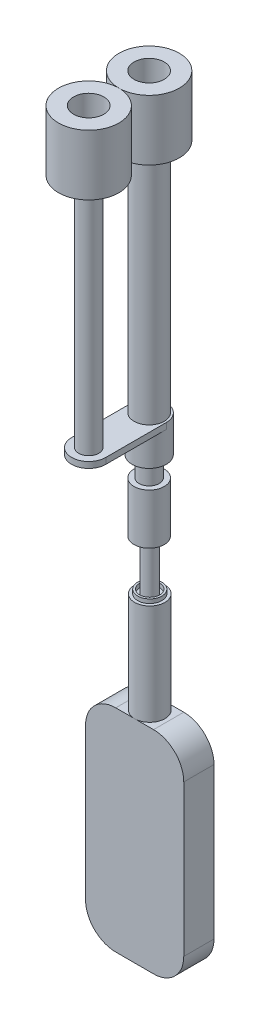
ISO-10303-21;
HEADER;
FILE_DESCRIPTION(('STEP AP214'),'2;1');
FILE_NAME('part.step','',(''),(''),'','','');
FILE_SCHEMA(('AUTOMOTIVE_DESIGN { 1 0 10303 214 1 1 1 1 }'));
ENDSEC;
DATA;
#1=APPLICATION_CONTEXT('core data for automotive mechanical design processes');
#2=APPLICATION_PROTOCOL_DEFINITION('international standard','automotive_design',2000,#1);
#3=PRODUCT_CONTEXT('',#1,'mechanical');
#4=PRODUCT('Part','Part','',(#3));
#5=PRODUCT_RELATED_PRODUCT_CATEGORY('part','',(#4));
#6=PRODUCT_DEFINITION_FORMATION('','',#4);
#7=PRODUCT_DEFINITION_CONTEXT('part definition',#1,'design');
#8=PRODUCT_DEFINITION('design','',#6,#7);
#9=PRODUCT_DEFINITION_SHAPE('','',#8);
#10=(LENGTH_UNIT() NAMED_UNIT(*) SI_UNIT(.MILLI.,.METRE.));
#11=(NAMED_UNIT(*) PLANE_ANGLE_UNIT() SI_UNIT($,.RADIAN.));
#12=(NAMED_UNIT(*) SI_UNIT($,.STERADIAN.) SOLID_ANGLE_UNIT());
#13=UNCERTAINTY_MEASURE_WITH_UNIT(LENGTH_MEASURE(1.E-05),#10,'distance_accuracy_value','');
#14=(GEOMETRIC_REPRESENTATION_CONTEXT(3) GLOBAL_UNCERTAINTY_ASSIGNED_CONTEXT((#13)) GLOBAL_UNIT_ASSIGNED_CONTEXT((#10,
#11,#12)) REPRESENTATION_CONTEXT('',''));
#15=CARTESIAN_POINT('',(0.,0.,0.));
#16=DIRECTION('',(0.,0.,1.));
#17=DIRECTION('',(1.,0.,0.));
#18=AXIS2_PLACEMENT_3D('',#15,#16,#17);
#19=CARTESIAN_POINT('',(0.,102.5,5.));
#20=DIRECTION('',(0.,1.,0.));
#21=DIRECTION('',(-1.,0.,0.));
#22=AXIS2_PLACEMENT_3D('',#19,#20,#21);
#23=PLANE('',#22);
#24=CARTESIAN_POINT('',(0.,102.5,5.));
#25=DIRECTION('',(0.,1.,0.));
#26=DIRECTION('',(-1.,0.,0.));
#27=AXIS2_PLACEMENT_3D('',#24,#25,#26);
#28=CIRCLE('',#27,3.5);
#29=CARTESIAN_POINT('',(-3.50000000000002,102.5,5.));
#30=VERTEX_POINT('',#29);
#31=EDGE_CURVE('E252',#30,#30,#28,.T.);
#32=ORIENTED_EDGE('',*,*,#31,.F.);
#33=EDGE_LOOP('',(#32));
#34=FACE_BOUND('',#33,.T.);
#35=CARTESIAN_POINT('',(0.,102.5,5.));
#36=DIRECTION('',(0.,1.,0.));
#37=DIRECTION('',(-1.,0.,0.));
#38=AXIS2_PLACEMENT_3D('',#35,#36,#37);
#39=CIRCLE('',#38,5.);
#40=CARTESIAN_POINT('',(-5.00000000000002,102.5,5.));
#41=VERTEX_POINT('',#40);
#42=EDGE_CURVE('E178',#41,#41,#39,.F.);
#43=ORIENTED_EDGE('',*,*,#42,.F.);
#44=EDGE_LOOP('',(#43));
#45=FACE_BOUND('',#44,.T.);
#46=ADVANCED_FACE('F45',(#34,#45),#23,.T.);
#47=CARTESIAN_POINT('',(0.,127.5,5.));
#48=DIRECTION('',(0.,-1.,0.));
#49=DIRECTION('',(1.,0.,0.));
#50=AXIS2_PLACEMENT_3D('',#47,#48,#49);
#51=CYLINDRICAL_SURFACE('',#50,3.5);
#52=CARTESIAN_POINT('',(0.,127.5,5.));
#53=DIRECTION('',(0.,1.,0.));
#54=DIRECTION('',(-1.,0.,0.));
#55=AXIS2_PLACEMENT_3D('',#52,#53,#54);
#56=CIRCLE('',#55,3.5);
#57=CARTESIAN_POINT('',(-3.50000000000003,127.5,5.));
#58=VERTEX_POINT('',#57);
#59=EDGE_CURVE('E256',#58,#58,#56,.T.);
#60=ORIENTED_EDGE('',*,*,#59,.F.);
#61=EDGE_LOOP('',(#60));
#62=FACE_BOUND('',#61,.T.);
#63=ORIENTED_EDGE('',*,*,#31,.T.);
#64=EDGE_LOOP('',(#63));
#65=FACE_BOUND('',#64,.T.);
#66=ADVANCED_FACE('F307',(#62,#65),#51,.T.);
#67=CARTESIAN_POINT('',(0.,152.5,5.30709787273054));
#68=DIRECTION('',(0.,-1.,0.));
#69=DIRECTION('',(1.,0.,0.));
#70=AXIS2_PLACEMENT_3D('',#67,#68,#69);
#71=CYLINDRICAL_SURFACE('',#70,7.5);
#72=CARTESIAN_POINT('',(0.,152.5,5.30709787273054));
#73=DIRECTION('',(0.,1.,0.));
#74=DIRECTION('',(-1.,0.,0.));
#75=AXIS2_PLACEMENT_3D('',#72,#73,#74);
#76=CIRCLE('',#75,7.5);
#77=CARTESIAN_POINT('',(-7.50000000000003,152.5,5.30709787273054));
#78=VERTEX_POINT('',#77);
#79=EDGE_CURVE('E260',#78,#78,#76,.T.);
#80=ORIENTED_EDGE('',*,*,#79,.F.);
#81=EDGE_LOOP('',(#80));
#82=FACE_BOUND('',#81,.T.);
#83=CARTESIAN_POINT('',(0.,127.5,5.30709787273054));
#84=DIRECTION('',(0.,1.,0.));
#85=DIRECTION('',(-1.,0.,0.));
#86=AXIS2_PLACEMENT_3D('',#83,#84,#85);
#87=CIRCLE('',#86,7.5);
#88=CARTESIAN_POINT('',(-7.50000000000003,127.5,5.30709787273054));
#89=VERTEX_POINT('',#88);
#90=EDGE_CURVE('E255',#89,#89,#87,.T.);
#91=ORIENTED_EDGE('',*,*,#90,.T.);
#92=EDGE_LOOP('',(#91));
#93=FACE_BOUND('',#92,.T.);
#94=ADVANCED_FACE('F314',(#82,#93),#71,.T.);
#95=CARTESIAN_POINT('',(0.,152.5,5.30709787273054));
#96=DIRECTION('',(0.,1.,0.));
#97=DIRECTION('',(-1.,0.,0.));
#98=AXIS2_PLACEMENT_3D('',#95,#96,#97);
#99=PLANE('',#98);
#100=CARTESIAN_POINT('',(0.,152.5,5.30709787273054));
#101=DIRECTION('',(0.,1.,0.));
#102=DIRECTION('',(-1.,0.,0.));
#103=AXIS2_PLACEMENT_3D('',#100,#101,#102);
#104=CIRCLE('',#103,5.);
#105=CARTESIAN_POINT('',(-5.00000000000003,152.5,5.30709787273054));
#106=VERTEX_POINT('',#105);
#107=EDGE_CURVE('E259',#106,#106,#104,.T.);
#108=ORIENTED_EDGE('',*,*,#107,.F.);
#109=EDGE_LOOP('',(#108));
#110=FACE_BOUND('',#109,.T.);
#111=ORIENTED_EDGE('',*,*,#79,.T.);
#112=EDGE_LOOP('',(#111));
#113=FACE_BOUND('',#112,.T.);
#114=ADVANCED_FACE('F553',(#110,#113),#99,.T.);
#115=CARTESIAN_POINT('',(0.,127.5,5.30709787273054));
#116=DIRECTION('',(0.,1.,0.));
#117=DIRECTION('',(-1.,0.,0.));
#118=AXIS2_PLACEMENT_3D('',#115,#116,#117);
#119=PLANE('',#118);
#120=ORIENTED_EDGE('',*,*,#59,.T.);
#121=EDGE_LOOP('',(#120));
#122=FACE_BOUND('',#121,.T.);
#123=ORIENTED_EDGE('',*,*,#90,.F.);
#124=EDGE_LOOP('',(#123));
#125=FACE_BOUND('',#124,.T.);
#126=ADVANCED_FACE('F549',(#122,#125),#119,.F.);
#127=CARTESIAN_POINT('',(0.,162.5,5.30709787273054));
#128=DIRECTION('',(0.,-1.,0.));
#129=DIRECTION('',(1.,0.,0.));
#130=AXIS2_PLACEMENT_3D('',#127,#128,#129);
#131=CYLINDRICAL_SURFACE('',#130,5.);
#132=CARTESIAN_POINT('',(0.,162.5,5.30709787273054));
#133=DIRECTION('',(0.,1.,0.));
#134=DIRECTION('',(-1.,0.,0.));
#135=AXIS2_PLACEMENT_3D('',#132,#133,#134);
#136=CIRCLE('',#135,5.);
#137=CARTESIAN_POINT('',(-5.00000000000003,162.5,5.30709787273054));
#138=VERTEX_POINT('',#137);
#139=EDGE_CURVE('E268',#138,#138,#136,.T.);
#140=ORIENTED_EDGE('',*,*,#139,.F.);
#141=EDGE_LOOP('',(#140));
#142=FACE_BOUND('',#141,.T.);
#143=ORIENTED_EDGE('',*,*,#107,.T.);
#144=EDGE_LOOP('',(#143));
#145=FACE_BOUND('',#144,.T.);
#146=ADVANCED_FACE('F540',(#142,#145),#131,.T.);
#147=CARTESIAN_POINT('',(0.,177.5,5.30709787273054));
#148=DIRECTION('',(0.,-1.,0.));
#149=DIRECTION('',(1.,0.,0.));
#150=AXIS2_PLACEMENT_3D('',#147,#148,#149);
#151=CYLINDRICAL_SURFACE('',#150,8.5);
#152=CARTESIAN_POINT('',(0.,177.5,5.30709787273054));
#153=DIRECTION('',(0.,1.,0.));
#154=DIRECTION('',(-1.,0.,0.));
#155=AXIS2_PLACEMENT_3D('',#152,#153,#154);
#156=CIRCLE('',#155,8.5);
#157=CARTESIAN_POINT('',(-8.50000000000004,177.5,5.30709787273054));
#158=VERTEX_POINT('',#157);
#159=CARTESIAN_POINT('',(8.49999999999996,177.5,5.30709787273052));
#160=VERTEX_POINT('',#159);
#161=EDGE_CURVE('E62',#158,#160,#156,.T.);
#162=ORIENTED_EDGE('',*,*,#161,.F.);
#163=DIRECTION('',(0.,-1.,0.));
#164=VECTOR('',#163,1.);
#165=CARTESIAN_POINT('',(-8.50000000000004,180.5,5.30709787273054));
#166=LINE('',#165,#164);
#167=CARTESIAN_POINT('',(-8.50000000000004,180.5,5.30709787273054));
#168=VERTEX_POINT('',#167);
#169=EDGE_CURVE('E283',#168,#158,#166,.T.);
#170=ORIENTED_EDGE('',*,*,#169,.F.);
#171=CARTESIAN_POINT('',(0.,180.5,5.30709787273054));
#172=DIRECTION('',(0.,1.,0.));
#173=DIRECTION('',(0.,0.,1.));
#174=AXIS2_PLACEMENT_3D('',#171,#172,#173);
#175=CIRCLE('',#174,8.5);
#176=CARTESIAN_POINT('',(8.49999999999996,180.5,5.30709787273054));
#177=VERTEX_POINT('',#176);
#178=EDGE_CURVE('E143',#177,#168,#175,.T.);
#179=ORIENTED_EDGE('',*,*,#178,.F.);
#180=DIRECTION('',(0.,-1.,0.));
#181=VECTOR('',#180,1.);
#182=CARTESIAN_POINT('',(8.49999999999996,180.5,5.30709787273054));
#183=LINE('',#182,#181);
#184=EDGE_CURVE('E267',#177,#160,#183,.T.);
#185=ORIENTED_EDGE('',*,*,#184,.T.);
#186=EDGE_LOOP('',(#162,#170,#179,#185));
#187=FACE_BOUND('',#186,.T.);
#188=CARTESIAN_POINT('',(0.,162.5,5.30709787273054));
#189=DIRECTION('',(0.,1.,0.));
#190=DIRECTION('',(-1.,0.,0.));
#191=AXIS2_PLACEMENT_3D('',#188,#189,#190);
#192=CIRCLE('',#191,8.5);
#193=CARTESIAN_POINT('',(-8.50000000000004,162.5,5.30709787273054));
#194=VERTEX_POINT('',#193);
#195=EDGE_CURVE('E272',#194,#194,#192,.T.);
#196=ORIENTED_EDGE('',*,*,#195,.T.);
#197=EDGE_LOOP('',(#196));
#198=FACE_BOUND('',#197,.T.);
#199=ADVANCED_FACE('F529',(#187,#198),#151,.T.);
#200=CARTESIAN_POINT('',(0.,162.5,5.30709787273054));
#201=DIRECTION('',(0.,1.,0.));
#202=DIRECTION('',(-1.,0.,0.));
#203=AXIS2_PLACEMENT_3D('',#200,#201,#202);
#204=PLANE('',#203);
#205=ORIENTED_EDGE('',*,*,#139,.T.);
#206=EDGE_LOOP('',(#205));
#207=FACE_BOUND('',#206,.T.);
#208=ORIENTED_EDGE('',*,*,#195,.F.);
#209=EDGE_LOOP('',(#208));
#210=FACE_BOUND('',#209,.T.);
#211=ADVANCED_FACE('F517',(#207,#210),#204,.F.);
#212=CARTESIAN_POINT('',(0.,104.5,5.));
#213=DIRECTION('',(0.,1.,0.));
#214=DIRECTION('',(-1.,0.,0.));
#215=AXIS2_PLACEMENT_3D('',#212,#213,#214);
#216=PLANE('',#215);
#217=CARTESIAN_POINT('',(0.,104.5,5.));
#218=DIRECTION('',(0.,1.,0.));
#219=DIRECTION('',(-1.,0.,0.));
#220=AXIS2_PLACEMENT_3D('',#217,#218,#219);
#221=CIRCLE('',#220,6.);
#222=CARTESIAN_POINT('',(-6.00000000000002,104.5,5.));
#223=VERTEX_POINT('',#222);
#224=EDGE_CURVE('E271',#223,#223,#221,.T.);
#225=ORIENTED_EDGE('',*,*,#224,.T.);
#226=EDGE_LOOP('',(#225));
#227=FACE_BOUND('',#226,.T.);
#228=CARTESIAN_POINT('',(0.,104.5,5.));
#229=DIRECTION('',(0.,1.,0.));
#230=DIRECTION('',(-1.,0.,0.));
#231=AXIS2_PLACEMENT_3D('',#228,#229,#230);
#232=CIRCLE('',#231,5.);
#233=CARTESIAN_POINT('',(-5.00000000000002,104.5,5.));
#234=VERTEX_POINT('',#233);
#235=EDGE_CURVE('E182',#234,#234,#232,.T.);
#236=ORIENTED_EDGE('',*,*,#235,.F.);
#237=EDGE_LOOP('',(#236));
#238=FACE_BOUND('',#237,.T.);
#239=ADVANCED_FACE('F522',(#227,#238),#216,.T.);
#240=CARTESIAN_POINT('',(0.,104.5,5.));
#241=DIRECTION('',(0.,-1.,0.));
#242=DIRECTION('',(1.,0.,0.));
#243=AXIS2_PLACEMENT_3D('',#240,#241,#242);
#244=CYLINDRICAL_SURFACE('',#243,6.);
#245=ORIENTED_EDGE('',*,*,#224,.F.);
#246=EDGE_LOOP('',(#245));
#247=FACE_BOUND('',#246,.T.);
#248=CARTESIAN_POINT('',(0.,102.5,5.));
#249=DIRECTION('',(0.,1.,0.));
#250=DIRECTION('',(-1.,0.,0.));
#251=AXIS2_PLACEMENT_3D('',#248,#249,#250);
#252=CIRCLE('',#251,6.);
#253=CARTESIAN_POINT('',(-6.00000000000002,102.5,5.));
#254=VERTEX_POINT('',#253);
#255=EDGE_CURVE('E276',#254,#254,#252,.T.);
#256=ORIENTED_EDGE('',*,*,#255,.T.);
#257=EDGE_LOOP('',(#256));
#258=FACE_BOUND('',#257,.T.);
#259=ADVANCED_FACE('F387',(#247,#258),#244,.T.);
#260=CARTESIAN_POINT('',(0.,104.5,5.));
#261=DIRECTION('',(0.,-1.,0.));
#262=DIRECTION('',(1.,0.,0.));
#263=AXIS2_PLACEMENT_3D('',#260,#261,#262);
#264=CYLINDRICAL_SURFACE('',#263,5.);
#265=ORIENTED_EDGE('',*,*,#235,.T.);
#266=EDGE_LOOP('',(#265));
#267=FACE_BOUND('',#266,.T.);
#268=ORIENTED_EDGE('',*,*,#42,.T.);
#269=EDGE_LOOP('',(#268));
#270=FACE_BOUND('',#269,.T.);
#271=ADVANCED_FACE('F380',(#267,#270),#264,.F.);
#272=CARTESIAN_POINT('',(24.375,52.5,12.5));
#273=DIRECTION('',(-1.,0.,0.));
#274=DIRECTION('',(0.,-1.,0.));
#275=AXIS2_PLACEMENT_3D('',#272,#273,#274);
#276=PLANE('',#275);
#277=DIRECTION('',(0.,1.,0.));
#278=VECTOR('',#277,1.);
#279=CARTESIAN_POINT('',(24.375,52.5,12.5));
#280=LINE('',#279,#278);
#281=CARTESIAN_POINT('',(24.375,-37.5,12.5));
#282=VERTEX_POINT('',#281);
#283=CARTESIAN_POINT('',(24.375,37.5,12.5));
#284=VERTEX_POINT('',#283);
#285=EDGE_CURVE('E203',#282,#284,#280,.T.);
#286=ORIENTED_EDGE('',*,*,#285,.F.);
#287=DIRECTION('',(0.,0.,-1.));
#288=VECTOR('',#287,1.);
#289=CARTESIAN_POINT('',(24.375,-37.5,12.5));
#290=LINE('',#289,#288);
#291=CARTESIAN_POINT('',(24.375,-37.5,-2.5));
#292=VERTEX_POINT('',#291);
#293=EDGE_CURVE('E181',#282,#292,#290,.T.);
#294=ORIENTED_EDGE('',*,*,#293,.T.);
#295=DIRECTION('',(0.,1.,0.));
#296=VECTOR('',#295,1.);
#297=CARTESIAN_POINT('',(24.375,52.5,-2.5));
#298=LINE('',#297,#296);
#299=CARTESIAN_POINT('',(24.375,37.5,-2.5));
#300=VERTEX_POINT('',#299);
#301=EDGE_CURVE('E193',#292,#300,#298,.T.);
#302=ORIENTED_EDGE('',*,*,#301,.T.);
#303=DIRECTION('',(0.,0.,-1.));
#304=VECTOR('',#303,1.);
#305=CARTESIAN_POINT('',(24.375,37.5,12.5));
#306=LINE('',#305,#304);
#307=EDGE_CURVE('E194',#300,#284,#306,.F.);
#308=ORIENTED_EDGE('',*,*,#307,.T.);
#309=EDGE_LOOP('',(#286,#294,#302,#308));
#310=FACE_BOUND('',#309,.T.);
#311=ADVANCED_FACE('F378',(#310),#276,.F.);
#312=CARTESIAN_POINT('',(9.37500000000001,-37.5,12.5));
#313=DIRECTION('',(0.,0.,-1.));
#314=DIRECTION('',(-1.,0.,0.));
#315=AXIS2_PLACEMENT_3D('',#312,#313,#314);
#316=CYLINDRICAL_SURFACE('',#315,15.);
#317=CARTESIAN_POINT('',(9.37500000000001,-37.5,12.5));
#318=DIRECTION('',(0.,0.,-1.));
#319=DIRECTION('',(-1.,0.,0.));
#320=AXIS2_PLACEMENT_3D('',#317,#318,#319);
#321=CIRCLE('',#320,15.);
#322=CARTESIAN_POINT('',(9.37500000000001,-52.5,12.5));
#323=VERTEX_POINT('',#322);
#324=EDGE_CURVE('E201',#323,#282,#321,.F.);
#325=ORIENTED_EDGE('',*,*,#324,.F.);
#326=DIRECTION('',(0.,0.,-1.));
#327=VECTOR('',#326,1.);
#328=CARTESIAN_POINT('',(9.37500000000001,-52.5,12.5));
#329=LINE('',#328,#327);
#330=CARTESIAN_POINT('',(9.37500000000001,-52.5,-2.5));
#331=VERTEX_POINT('',#330);
#332=EDGE_CURVE('E228',#331,#323,#329,.F.);
#333=ORIENTED_EDGE('',*,*,#332,.F.);
#334=CARTESIAN_POINT('',(9.37500000000001,-37.5,-2.5));
#335=DIRECTION('',(0.,0.,-1.));
#336=DIRECTION('',(-1.,0.,0.));
#337=AXIS2_PLACEMENT_3D('',#334,#335,#336);
#338=CIRCLE('',#337,15.);
#339=EDGE_CURVE('E219',#292,#331,#338,.T.);
#340=ORIENTED_EDGE('',*,*,#339,.F.);
#341=ORIENTED_EDGE('',*,*,#293,.F.);
#342=EDGE_LOOP('',(#325,#333,#340,#341));
#343=FACE_BOUND('',#342,.T.);
#344=ADVANCED_FACE('F375',(#343),#316,.T.);
#345=CARTESIAN_POINT('',(24.375,-52.5,12.5));
#346=DIRECTION('',(0.,1.,0.));
#347=DIRECTION('',(-1.,0.,0.));
#348=AXIS2_PLACEMENT_3D('',#345,#346,#347);
#349=PLANE('',#348);
#350=DIRECTION('',(1.,0.,0.));
#351=VECTOR('',#350,1.);
#352=CARTESIAN_POINT('',(24.375,-52.5,12.5));
#353=LINE('',#352,#351);
#354=CARTESIAN_POINT('',(-9.37499999999999,-52.5,12.5));
#355=VERTEX_POINT('',#354);
#356=EDGE_CURVE('E199',#355,#323,#353,.T.);
#357=ORIENTED_EDGE('',*,*,#356,.F.);
#358=DIRECTION('',(0.,0.,-1.));
#359=VECTOR('',#358,1.);
#360=CARTESIAN_POINT('',(-9.37499999999999,-52.5,12.5));
#361=LINE('',#360,#359);
#362=CARTESIAN_POINT('',(-9.37499999999999,-52.5,-2.5));
#363=VERTEX_POINT('',#362);
#364=EDGE_CURVE('E196',#355,#363,#361,.T.);
#365=ORIENTED_EDGE('',*,*,#364,.T.);
#366=DIRECTION('',(1.,0.,0.));
#367=VECTOR('',#366,1.);
#368=CARTESIAN_POINT('',(24.375,-52.5,-2.5));
#369=LINE('',#368,#367);
#370=EDGE_CURVE('E227',#363,#331,#369,.T.);
#371=ORIENTED_EDGE('',*,*,#370,.T.);
#372=ORIENTED_EDGE('',*,*,#332,.T.);
#373=EDGE_LOOP('',(#357,#365,#371,#372));
#374=FACE_BOUND('',#373,.T.);
#375=ADVANCED_FACE('F372',(#374),#349,.F.);
#376=CARTESIAN_POINT('',(-9.37499999999999,-37.5,12.5));
#377=DIRECTION('',(0.,0.,-1.));
#378=DIRECTION('',(-1.,0.,0.));
#379=AXIS2_PLACEMENT_3D('',#376,#377,#378);
#380=CYLINDRICAL_SURFACE('',#379,15.);
#381=CARTESIAN_POINT('',(-9.37499999999999,-37.5,12.5));
#382=DIRECTION('',(0.,0.,-1.));
#383=DIRECTION('',(-1.,0.,0.));
#384=AXIS2_PLACEMENT_3D('',#381,#382,#383);
#385=CIRCLE('',#384,15.);
#386=CARTESIAN_POINT('',(-24.375,-37.5,12.5));
#387=VERTEX_POINT('',#386);
#388=EDGE_CURVE('E197',#387,#355,#385,.F.);
#389=ORIENTED_EDGE('',*,*,#388,.F.);
#390=DIRECTION('',(0.,0.,-1.));
#391=VECTOR('',#390,1.);
#392=CARTESIAN_POINT('',(-24.375,-37.5,12.5));
#393=LINE('',#392,#391);
#394=CARTESIAN_POINT('',(-24.375,-37.5,-2.5));
#395=VERTEX_POINT('',#394);
#396=EDGE_CURVE('E210',#395,#387,#393,.F.);
#397=ORIENTED_EDGE('',*,*,#396,.F.);
#398=CARTESIAN_POINT('',(-9.37499999999999,-37.5,-2.5));
#399=DIRECTION('',(0.,0.,-1.));
#400=DIRECTION('',(-1.,0.,0.));
#401=AXIS2_PLACEMENT_3D('',#398,#399,#400);
#402=CIRCLE('',#401,15.);
#403=EDGE_CURVE('E216',#363,#395,#402,.T.);
#404=ORIENTED_EDGE('',*,*,#403,.F.);
#405=ORIENTED_EDGE('',*,*,#364,.F.);
#406=EDGE_LOOP('',(#389,#397,#404,#405));
#407=FACE_BOUND('',#406,.T.);
#408=ADVANCED_FACE('F367',(#407),#380,.T.);
#409=CARTESIAN_POINT('',(-24.375,52.5,12.5));
#410=DIRECTION('',(1.,0.,0.));
#411=DIRECTION('',(0.,1.,0.));
#412=AXIS2_PLACEMENT_3D('',#409,#410,#411);
#413=PLANE('',#412);
#414=DIRECTION('',(0.,-1.,0.));
#415=VECTOR('',#414,1.);
#416=CARTESIAN_POINT('',(-24.375,52.5,-2.5));
#417=LINE('',#416,#415);
#418=CARTESIAN_POINT('',(-24.375,37.5,-2.5));
#419=VERTEX_POINT('',#418);
#420=EDGE_CURVE('E213',#419,#395,#417,.T.);
#421=ORIENTED_EDGE('',*,*,#420,.T.);
#422=ORIENTED_EDGE('',*,*,#396,.T.);
#423=DIRECTION('',(0.,-1.,0.));
#424=VECTOR('',#423,1.);
#425=CARTESIAN_POINT('',(-24.375,52.5,12.5));
#426=LINE('',#425,#424);
#427=CARTESIAN_POINT('',(-24.375,37.5,12.5));
#428=VERTEX_POINT('',#427);
#429=EDGE_CURVE('E200',#428,#387,#426,.T.);
#430=ORIENTED_EDGE('',*,*,#429,.F.);
#431=DIRECTION('',(0.,0.,-1.));
#432=VECTOR('',#431,1.);
#433=CARTESIAN_POINT('',(-24.375,37.5,12.5));
#434=LINE('',#433,#432);
#435=EDGE_CURVE('E212',#428,#419,#434,.T.);
#436=ORIENTED_EDGE('',*,*,#435,.T.);
#437=EDGE_LOOP('',(#421,#422,#430,#436));
#438=FACE_BOUND('',#437,.T.);
#439=ADVANCED_FACE('F364',(#438),#413,.F.);
#440=CARTESIAN_POINT('',(-9.37499999999999,37.5,12.5));
#441=DIRECTION('',(0.,0.,-1.));
#442=DIRECTION('',(-1.,0.,0.));
#443=AXIS2_PLACEMENT_3D('',#440,#441,#442);
#444=CYLINDRICAL_SURFACE('',#443,15.);
#445=CARTESIAN_POINT('',(-9.37499999999999,37.5,12.5));
#446=DIRECTION('',(0.,0.,-1.));
#447=DIRECTION('',(-1.,0.,0.));
#448=AXIS2_PLACEMENT_3D('',#445,#446,#447);
#449=CIRCLE('',#448,15.);
#450=CARTESIAN_POINT('',(-9.375,52.5,12.5));
#451=VERTEX_POINT('',#450);
#452=EDGE_CURVE('E207',#451,#428,#449,.F.);
#453=ORIENTED_EDGE('',*,*,#452,.F.);
#454=DIRECTION('',(0.,0.,-1.));
#455=VECTOR('',#454,1.);
#456=CARTESIAN_POINT('',(-9.375,52.5,12.5));
#457=LINE('',#456,#455);
#458=CARTESIAN_POINT('',(-9.375,52.5,-2.5));
#459=VERTEX_POINT('',#458);
#460=EDGE_CURVE('E187',#459,#451,#457,.F.);
#461=ORIENTED_EDGE('',*,*,#460,.F.);
#462=CARTESIAN_POINT('',(-9.37499999999999,37.5,-2.5));
#463=DIRECTION('',(0.,0.,-1.));
#464=DIRECTION('',(-1.,0.,0.));
#465=AXIS2_PLACEMENT_3D('',#462,#463,#464);
#466=CIRCLE('',#465,15.);
#467=EDGE_CURVE('E218',#419,#459,#466,.T.);
#468=ORIENTED_EDGE('',*,*,#467,.F.);
#469=ORIENTED_EDGE('',*,*,#435,.F.);
#470=EDGE_LOOP('',(#453,#461,#468,#469));
#471=FACE_BOUND('',#470,.T.);
#472=ADVANCED_FACE('F360',(#471),#444,.T.);
#473=CARTESIAN_POINT('',(0.,0.,-2.5));
#474=DIRECTION('',(0.,0.,-1.));
#475=DIRECTION('',(-1.,0.,0.));
#476=AXIS2_PLACEMENT_3D('',#473,#474,#475);
#477=PLANE('',#476);
#478=ORIENTED_EDGE('',*,*,#370,.F.);
#479=ORIENTED_EDGE('',*,*,#403,.T.);
#480=ORIENTED_EDGE('',*,*,#420,.F.);
#481=ORIENTED_EDGE('',*,*,#467,.T.);
#482=DIRECTION('',(-1.,0.,0.));
#483=VECTOR('',#482,1.);
#484=CARTESIAN_POINT('',(24.375,52.5,-2.5));
#485=LINE('',#484,#483);
#486=CARTESIAN_POINT('',(0.,52.5,-2.5));
#487=VERTEX_POINT('',#486);
#488=EDGE_CURVE('E190',#487,#459,#485,.T.);
#489=ORIENTED_EDGE('',*,*,#488,.F.);
#490=CARTESIAN_POINT('',(9.375,52.5,-2.5));
#491=VERTEX_POINT('',#490);
#492=EDGE_CURVE('E186',#491,#487,#485,.T.);
#493=ORIENTED_EDGE('',*,*,#492,.F.);
#494=CARTESIAN_POINT('',(9.375,37.5,-2.5));
#495=DIRECTION('',(0.,0.,-1.));
#496=DIRECTION('',(-1.,0.,0.));
#497=AXIS2_PLACEMENT_3D('',#494,#495,#496);
#498=CIRCLE('',#497,15.);
#499=EDGE_CURVE('E221',#491,#300,#498,.T.);
#500=ORIENTED_EDGE('',*,*,#499,.T.);
#501=ORIENTED_EDGE('',*,*,#301,.F.);
#502=ORIENTED_EDGE('',*,*,#339,.T.);
#503=EDGE_LOOP('',(#478,#479,#480,#481,#489,#493,#500,#501,#502));
#504=FACE_BOUND('',#503,.T.);
#505=ADVANCED_FACE('F355',(#504),#477,.T.);
#506=CARTESIAN_POINT('',(9.375,37.5,12.5));
#507=DIRECTION('',(0.,0.,-1.));
#508=DIRECTION('',(-1.,0.,0.));
#509=AXIS2_PLACEMENT_3D('',#506,#507,#508);
#510=CYLINDRICAL_SURFACE('',#509,15.);
#511=CARTESIAN_POINT('',(9.375,37.5,12.5));
#512=DIRECTION('',(0.,0.,-1.));
#513=DIRECTION('',(-1.,0.,0.));
#514=AXIS2_PLACEMENT_3D('',#511,#512,#513);
#515=CIRCLE('',#514,15.);
#516=CARTESIAN_POINT('',(9.375,52.5,12.5));
#517=VERTEX_POINT('',#516);
#518=EDGE_CURVE('E204',#284,#517,#515,.F.);
#519=ORIENTED_EDGE('',*,*,#518,.F.);
#520=ORIENTED_EDGE('',*,*,#307,.F.);
#521=ORIENTED_EDGE('',*,*,#499,.F.);
#522=DIRECTION('',(0.,0.,-1.));
#523=VECTOR('',#522,1.);
#524=CARTESIAN_POINT('',(9.375,52.5,12.5));
#525=LINE('',#524,#523);
#526=EDGE_CURVE('E183',#517,#491,#525,.T.);
#527=ORIENTED_EDGE('',*,*,#526,.F.);
#528=EDGE_LOOP('',(#519,#520,#521,#527));
#529=FACE_BOUND('',#528,.T.);
#530=ADVANCED_FACE('F352',(#529),#510,.T.);
#531=CARTESIAN_POINT('',(0.,0.,12.5));
#532=DIRECTION('',(0.,0.,-1.));
#533=DIRECTION('',(-1.,0.,0.));
#534=AXIS2_PLACEMENT_3D('',#531,#532,#533);
#535=PLANE('',#534);
#536=ORIENTED_EDGE('',*,*,#429,.T.);
#537=ORIENTED_EDGE('',*,*,#388,.T.);
#538=ORIENTED_EDGE('',*,*,#356,.T.);
#539=ORIENTED_EDGE('',*,*,#324,.T.);
#540=ORIENTED_EDGE('',*,*,#285,.T.);
#541=ORIENTED_EDGE('',*,*,#518,.T.);
#542=DIRECTION('',(-1.,0.,0.));
#543=VECTOR('',#542,1.);
#544=CARTESIAN_POINT('',(24.375,52.5,12.5));
#545=LINE('',#544,#543);
#546=CARTESIAN_POINT('',(0.,52.5,12.5));
#547=VERTEX_POINT('',#546);
#548=EDGE_CURVE('E206',#517,#547,#545,.T.);
#549=ORIENTED_EDGE('',*,*,#548,.T.);
#550=EDGE_CURVE('E209',#547,#451,#545,.T.);
#551=ORIENTED_EDGE('',*,*,#550,.T.);
#552=ORIENTED_EDGE('',*,*,#452,.T.);
#553=EDGE_LOOP('',(#536,#537,#538,#539,#540,#541,#549,#551,#552));
#554=FACE_BOUND('',#553,.T.);
#555=ADVANCED_FACE('F347',(#554),#535,.F.);
#556=CARTESIAN_POINT('',(24.375,52.5,12.5));
#557=DIRECTION('',(0.,-1.,0.));
#558=DIRECTION('',(1.,0.,0.));
#559=AXIS2_PLACEMENT_3D('',#556,#557,#558);
#560=PLANE('',#559);
#561=CARTESIAN_POINT('',(0.,52.5,5.));
#562=DIRECTION('',(0.,1.,0.));
#563=DIRECTION('',(-1.,0.,0.));
#564=AXIS2_PLACEMENT_3D('',#561,#562,#563);
#565=CIRCLE('',#564,7.5);
#566=EDGE_CURVE('E248',#487,#547,#565,.T.);
#567=ORIENTED_EDGE('',*,*,#566,.F.);
#568=ORIENTED_EDGE('',*,*,#488,.T.);
#569=ORIENTED_EDGE('',*,*,#460,.T.);
#570=ORIENTED_EDGE('',*,*,#550,.F.);
#571=EDGE_LOOP('',(#567,#568,#569,#570));
#572=FACE_BOUND('',#571,.T.);
#573=ADVANCED_FACE('F343',(#572),#560,.F.);
#574=EDGE_CURVE('E231',#547,#487,#565,.T.);
#575=ORIENTED_EDGE('',*,*,#574,.F.);
#576=ORIENTED_EDGE('',*,*,#548,.F.);
#577=ORIENTED_EDGE('',*,*,#526,.T.);
#578=ORIENTED_EDGE('',*,*,#492,.T.);
#579=EDGE_LOOP('',(#575,#576,#577,#578));
#580=FACE_BOUND('',#579,.T.);
#581=ADVANCED_FACE('F328',(#580),#560,.F.);
#582=CARTESIAN_POINT('',(0.,102.5,5.));
#583=DIRECTION('',(0.,-1.,0.));
#584=DIRECTION('',(1.,0.,0.));
#585=AXIS2_PLACEMENT_3D('',#582,#583,#584);
#586=CYLINDRICAL_SURFACE('',#585,7.5);
#587=CARTESIAN_POINT('',(0.,102.5,5.));
#588=DIRECTION('',(0.,1.,0.));
#589=DIRECTION('',(-1.,0.,0.));
#590=AXIS2_PLACEMENT_3D('',#587,#588,#589);
#591=CIRCLE('',#590,7.5);
#592=CARTESIAN_POINT('',(-7.50000000000002,102.5,5.));
#593=VERTEX_POINT('',#592);
#594=EDGE_CURVE('E249',#593,#593,#591,.T.);
#595=ORIENTED_EDGE('',*,*,#594,.F.);
#596=EDGE_LOOP('',(#595));
#597=FACE_BOUND('',#596,.T.);
#598=ORIENTED_EDGE('',*,*,#574,.T.);
#599=ORIENTED_EDGE('',*,*,#566,.T.);
#600=EDGE_LOOP('',(#598,#599));
#601=FACE_BOUND('',#600,.T.);
#602=ADVANCED_FACE('F321',(#597,#601),#586,.T.);
#603=ORIENTED_EDGE('',*,*,#255,.F.);
#604=EDGE_LOOP('',(#603));
#605=FACE_BOUND('',#604,.T.);
#606=ORIENTED_EDGE('',*,*,#594,.T.);
#607=EDGE_LOOP('',(#606));
#608=FACE_BOUND('',#607,.T.);
#609=ADVANCED_FACE('F310',(#605,#608),#23,.T.);
#610=CARTESIAN_POINT('',(-8.50000000000004,180.5,5.30709787273054));
#611=DIRECTION('',(1.,0.,0.));
#612=DIRECTION('',(0.,0.,-1.));
#613=AXIS2_PLACEMENT_3D('',#610,#611,#612);
#614=PLANE('',#613);
#615=DIRECTION('',(0.,0.,1.));
#616=VECTOR('',#615,1.);
#617=CARTESIAN_POINT('',(-8.50000000000004,177.5,5.30709787273054));
#618=LINE('',#617,#616);
#619=CARTESIAN_POINT('',(-8.50000000000004,177.5,35.3070978727305));
#620=VERTEX_POINT('',#619);
#621=EDGE_CURVE('E151',#158,#620,#618,.T.);
#622=ORIENTED_EDGE('',*,*,#621,.T.);
#623=DIRECTION('',(0.,-1.,0.));
#624=VECTOR('',#623,1.);
#625=CARTESIAN_POINT('',(-8.50000000000004,180.5,35.3070978727305));
#626=LINE('',#625,#624);
#627=CARTESIAN_POINT('',(-8.50000000000004,180.5,35.3070978727305));
#628=VERTEX_POINT('',#627);
#629=EDGE_CURVE('E149',#628,#620,#626,.T.);
#630=ORIENTED_EDGE('',*,*,#629,.F.);
#631=DIRECTION('',(0.,0.,1.));
#632=VECTOR('',#631,1.);
#633=CARTESIAN_POINT('',(-8.50000000000004,180.5,5.30709787273054));
#634=LINE('',#633,#632);
#635=EDGE_CURVE('E136',#168,#628,#634,.T.);
#636=ORIENTED_EDGE('',*,*,#635,.F.);
#637=ORIENTED_EDGE('',*,*,#169,.T.);
#638=EDGE_LOOP('',(#622,#630,#636,#637));
#639=FACE_BOUND('',#638,.T.);
#640=ADVANCED_FACE('F150',(#639),#614,.F.);
#641=CARTESIAN_POINT('',(0.,180.5,35.3070978727305));
#642=DIRECTION('',(0.,-1.,0.));
#643=DIRECTION('',(0.,0.,-1.));
#644=AXIS2_PLACEMENT_3D('',#641,#642,#643);
#645=CYLINDRICAL_SURFACE('',#644,8.50000000000004);
#646=CARTESIAN_POINT('',(0.,177.5,35.3070978727305));
#647=DIRECTION('',(0.,1.,0.));
#648=DIRECTION('',(0.,0.,1.));
#649=AXIS2_PLACEMENT_3D('',#646,#647,#648);
#650=CIRCLE('',#649,8.50000000000004);
#651=CARTESIAN_POINT('',(8.50000000000004,177.5,35.3070978727305));
#652=VERTEX_POINT('',#651);
#653=EDGE_CURVE('E155',#620,#652,#650,.T.);
#654=ORIENTED_EDGE('',*,*,#653,.T.);
#655=DIRECTION('',(0.,-1.,0.));
#656=VECTOR('',#655,1.);
#657=CARTESIAN_POINT('',(8.50000000000004,180.5,35.3070978727305));
#658=LINE('',#657,#656);
#659=CARTESIAN_POINT('',(8.50000000000004,180.5,35.3070978727305));
#660=VERTEX_POINT('',#659);
#661=EDGE_CURVE('E159',#660,#652,#658,.T.);
#662=ORIENTED_EDGE('',*,*,#661,.F.);
#663=CARTESIAN_POINT('',(0.,180.5,35.3070978727305));
#664=DIRECTION('',(0.,1.,0.));
#665=DIRECTION('',(0.,0.,1.));
#666=AXIS2_PLACEMENT_3D('',#663,#664,#665);
#667=CIRCLE('',#666,8.50000000000004);
#668=EDGE_CURVE('E140',#628,#660,#667,.T.);
#669=ORIENTED_EDGE('',*,*,#668,.F.);
#670=ORIENTED_EDGE('',*,*,#629,.T.);
#671=EDGE_LOOP('',(#654,#662,#669,#670));
#672=FACE_BOUND('',#671,.T.);
#673=ADVANCED_FACE('F157',(#672),#645,.T.);
#674=CARTESIAN_POINT('',(8.49999999999996,180.5,5.30709787273054));
#675=DIRECTION('',(-1.,0.,0.));
#676=DIRECTION('',(0.,0.,1.));
#677=AXIS2_PLACEMENT_3D('',#674,#675,#676);
#678=PLANE('',#677);
#679=DIRECTION('',(0.,0.,-1.));
#680=VECTOR('',#679,1.);
#681=CARTESIAN_POINT('',(8.49999999999996,177.5,5.30709787273054));
#682=LINE('',#681,#680);
#683=EDGE_CURVE('E154',#652,#160,#682,.T.);
#684=ORIENTED_EDGE('',*,*,#683,.T.);
#685=ORIENTED_EDGE('',*,*,#184,.F.);
#686=DIRECTION('',(0.,0.,-1.));
#687=VECTOR('',#686,1.);
#688=CARTESIAN_POINT('',(8.49999999999996,180.5,5.30709787273054));
#689=LINE('',#688,#687);
#690=EDGE_CURVE('E161',#660,#177,#689,.T.);
#691=ORIENTED_EDGE('',*,*,#690,.F.);
#692=ORIENTED_EDGE('',*,*,#661,.T.);
#693=EDGE_LOOP('',(#684,#685,#691,#692));
#694=FACE_BOUND('',#693,.T.);
#695=ADVANCED_FACE('F290',(#694),#678,.F.);
#696=CARTESIAN_POINT('',(0.,180.5,5.30709787273054));
#697=DIRECTION('',(0.,1.,0.));
#698=DIRECTION('',(0.,0.,1.));
#699=AXIS2_PLACEMENT_3D('',#696,#697,#698);
#700=PLANE('',#699);
#701=CARTESIAN_POINT('',(0.,180.5,35.3070978727305));
#702=DIRECTION('',(0.,1.,0.));
#703=DIRECTION('',(0.,0.,1.));
#704=AXIS2_PLACEMENT_3D('',#701,#702,#703);
#705=CIRCLE('',#704,5.);
#706=CARTESIAN_POINT('',(0.,180.5,40.3070978727305));
#707=VERTEX_POINT('',#706);
#708=EDGE_CURVE('E54',#707,#707,#705,.T.);
#709=ORIENTED_EDGE('',*,*,#708,.F.);
#710=EDGE_LOOP('',(#709));
#711=FACE_BOUND('',#710,.T.);
#712=CARTESIAN_POINT('',(0.,180.5,5.30709787273054));
#713=DIRECTION('',(0.,1.,0.));
#714=DIRECTION('',(0.,0.,1.));
#715=AXIS2_PLACEMENT_3D('',#712,#713,#714);
#716=CIRCLE('',#715,7.5);
#717=CARTESIAN_POINT('',(0.,180.5,12.8070978727305));
#718=VERTEX_POINT('',#717);
#719=EDGE_CURVE('E167',#718,#718,#716,.T.);
#720=ORIENTED_EDGE('',*,*,#719,.F.);
#721=EDGE_LOOP('',(#720));
#722=FACE_BOUND('',#721,.T.);
#723=ORIENTED_EDGE('',*,*,#178,.T.);
#724=ORIENTED_EDGE('',*,*,#635,.T.);
#725=ORIENTED_EDGE('',*,*,#668,.T.);
#726=ORIENTED_EDGE('',*,*,#690,.T.);
#727=EDGE_LOOP('',(#723,#724,#725,#726));
#728=FACE_BOUND('',#727,.T.);
#729=ADVANCED_FACE('F138',(#711,#722,#728),#700,.T.);
#730=CARTESIAN_POINT('',(0.,177.5,5.30709787273054));
#731=DIRECTION('',(0.,1.,0.));
#732=DIRECTION('',(0.,0.,1.));
#733=AXIS2_PLACEMENT_3D('',#730,#731,#732);
#734=PLANE('',#733);
#735=ORIENTED_EDGE('',*,*,#621,.F.);
#736=ORIENTED_EDGE('',*,*,#161,.T.);
#737=ORIENTED_EDGE('',*,*,#683,.F.);
#738=ORIENTED_EDGE('',*,*,#653,.F.);
#739=EDGE_LOOP('',(#735,#736,#737,#738));
#740=FACE_BOUND('',#739,.T.);
#741=ADVANCED_FACE('F292',(#740),#734,.F.);
#742=CARTESIAN_POINT('',(0.,297.5,5.30709787273054));
#743=DIRECTION('',(0.,1.,0.));
#744=DIRECTION('',(-1.,0.,0.));
#745=AXIS2_PLACEMENT_3D('',#742,#743,#744);
#746=PLANE('',#745);
#747=CARTESIAN_POINT('',(0.,297.5,5.30709787273054));
#748=DIRECTION('',(0.,1.,0.));
#749=DIRECTION('',(-1.,0.,0.));
#750=AXIS2_PLACEMENT_3D('',#747,#748,#749);
#751=CIRCLE('',#750,7.5);
#752=CARTESIAN_POINT('',(-7.50000000000006,297.5,5.30709787273054));
#753=VERTEX_POINT('',#752);
#754=EDGE_CURVE('E171',#753,#753,#751,.T.);
#755=ORIENTED_EDGE('',*,*,#754,.T.);
#756=EDGE_LOOP('',(#755));
#757=FACE_BOUND('',#756,.T.);
#758=ADVANCED_FACE('F294',(#757),#746,.T.);
#759=CARTESIAN_POINT('',(0.,297.5,5.30709787273054));
#760=DIRECTION('',(0.,-1.,0.));
#761=DIRECTION('',(1.,0.,0.));
#762=AXIS2_PLACEMENT_3D('',#759,#760,#761);
#763=CYLINDRICAL_SURFACE('',#762,7.5);
#764=ORIENTED_EDGE('',*,*,#719,.T.);
#765=EDGE_LOOP('',(#764));
#766=FACE_BOUND('',#765,.T.);
#767=ORIENTED_EDGE('',*,*,#754,.F.);
#768=EDGE_LOOP('',(#767));
#769=FACE_BOUND('',#768,.T.);
#770=ADVANCED_FACE('F300',(#766,#769),#763,.T.);
#771=CARTESIAN_POINT('',(0.,311.642135623731,35.3070978727305));
#772=DIRECTION('',(0.,-1.,0.));
#773=DIRECTION('',(0.,0.,-1.));
#774=AXIS2_PLACEMENT_3D('',#771,#772,#773);
#775=CYLINDRICAL_SURFACE('',#774,5.);
#776=ORIENTED_EDGE('',*,*,#708,.T.);
#777=EDGE_LOOP('',(#776));
#778=FACE_BOUND('',#777,.T.);
#779=CARTESIAN_POINT('',(0.,297.5,35.3070978727305));
#780=DIRECTION('',(0.,1.,0.));
#781=DIRECTION('',(0.,0.,1.));
#782=AXIS2_PLACEMENT_3D('',#779,#780,#781);
#783=CIRCLE('',#782,5.);
#784=CARTESIAN_POINT('',(0.,297.5,40.3070978727305));
#785=VERTEX_POINT('',#784);
#786=EDGE_CURVE('E12',#785,#785,#783,.T.);
#787=ORIENTED_EDGE('',*,*,#786,.F.);
#788=EDGE_LOOP('',(#787));
#789=FACE_BOUND('',#788,.T.);
#790=ADVANCED_FACE('F494',(#778,#789),#775,.T.);
#791=CARTESIAN_POINT('',(0.,297.5,35.3070978727305));
#792=DIRECTION('',(0.,1.,0.));
#793=DIRECTION('',(0.,0.,1.));
#794=AXIS2_PLACEMENT_3D('',#791,#792,#793);
#795=PLANE('',#794);
#796=ORIENTED_EDGE('',*,*,#786,.T.);
#797=EDGE_LOOP('',(#796));
#798=FACE_BOUND('',#797,.T.);
#799=ADVANCED_FACE('F47',(#798),#795,.T.);
#800=CLOSED_SHELL('',(#46,#66,#94,#114,#126,#146,#199,#211,#239,#259,#271,#311,#344,#375,#408,
#439,#472,#505,#530,#555,#573,#581,#602,#609,#640,#673,#695,#729,#741,#758,#770,#790,#799));
#801=MANIFOLD_SOLID_BREP('B2',#800);
#802=CARTESIAN_POINT('',(0.,327.5,5.30709787273054));
#803=DIRECTION('',(0.,-1.,0.));
#804=DIRECTION('',(1.,0.,0.));
#805=AXIS2_PLACEMENT_3D('',#802,#803,#804);
#806=CYLINDRICAL_SURFACE('',#805,7.5);
#807=CARTESIAN_POINT('',(0.,327.5,5.30709787273054));
#808=DIRECTION('',(0.,1.,0.));
#809=DIRECTION('',(0.,0.,1.));
#810=AXIS2_PLACEMENT_3D('',#807,#808,#809);
#811=CIRCLE('',#810,7.5);
#812=CARTESIAN_POINT('',(0.,327.5,12.8070978727305));
#813=VERTEX_POINT('',#812);
#814=EDGE_CURVE('E679',#813,#813,#811,.T.);
#815=ORIENTED_EDGE('',*,*,#814,.T.);
#816=EDGE_LOOP('',(#815));
#817=FACE_BOUND('',#816,.T.);
#818=CARTESIAN_POINT('',(0.,297.5,5.30709787273054));
#819=DIRECTION('',(0.,1.,0.));
#820=DIRECTION('',(0.,0.,1.));
#821=AXIS2_PLACEMENT_3D('',#818,#819,#820);
#822=CIRCLE('',#821,7.5);
#823=CARTESIAN_POINT('',(0.,297.5,12.8070978727305));
#824=VERTEX_POINT('',#823);
#825=EDGE_CURVE('E685',#824,#824,#822,.T.);
#826=ORIENTED_EDGE('',*,*,#825,.F.);
#827=EDGE_LOOP('',(#826));
#828=FACE_BOUND('',#827,.T.);
#829=ADVANCED_FACE('F672',(#817,#828),#806,.F.);
#830=CARTESIAN_POINT('',(0.,327.5,5.30709787273054));
#831=DIRECTION('',(0.,-1.,0.));
#832=DIRECTION('',(1.,0.,0.));
#833=AXIS2_PLACEMENT_3D('',#830,#831,#832);
#834=CYLINDRICAL_SURFACE('',#833,15.);
#835=CARTESIAN_POINT('',(0.,327.5,5.30709787273054));
#836=DIRECTION('',(0.,1.,0.));
#837=DIRECTION('',(0.,0.,1.));
#838=AXIS2_PLACEMENT_3D('',#835,#836,#837);
#839=CIRCLE('',#838,15.);
#840=CARTESIAN_POINT('',(0.,327.5,20.3070978727305));
#841=VERTEX_POINT('',#840);
#842=EDGE_CURVE('E44',#841,#841,#839,.T.);
#843=ORIENTED_EDGE('',*,*,#842,.F.);
#844=EDGE_LOOP('',(#843));
#845=FACE_BOUND('',#844,.T.);
#846=CARTESIAN_POINT('',(0.,297.5,5.30709787273054));
#847=DIRECTION('',(0.,1.,0.));
#848=DIRECTION('',(0.,0.,1.));
#849=AXIS2_PLACEMENT_3D('',#846,#847,#848);
#850=CIRCLE('',#849,15.);
#851=CARTESIAN_POINT('',(0.,297.5,20.3070978727305));
#852=VERTEX_POINT('',#851);
#853=EDGE_CURVE('E675',#852,#852,#850,.T.);
#854=ORIENTED_EDGE('',*,*,#853,.T.);
#855=EDGE_LOOP('',(#854));
#856=FACE_BOUND('',#855,.T.);
#857=ADVANCED_FACE('F692',(#845,#856),#834,.T.);
#858=CARTESIAN_POINT('',(0.,327.5,0.));
#859=DIRECTION('',(0.,1.,0.));
#860=DIRECTION('',(0.,0.,1.));
#861=AXIS2_PLACEMENT_3D('',#858,#859,#860);
#862=PLANE('',#861);
#863=ORIENTED_EDGE('',*,*,#814,.F.);
#864=EDGE_LOOP('',(#863));
#865=FACE_BOUND('',#864,.T.);
#866=ORIENTED_EDGE('',*,*,#842,.T.);
#867=EDGE_LOOP('',(#866));
#868=FACE_BOUND('',#867,.T.);
#869=ADVANCED_FACE('F696',(#865,#868),#862,.T.);
#870=CARTESIAN_POINT('',(0.,297.5,0.));
#871=DIRECTION('',(0.,1.,0.));
#872=DIRECTION('',(0.,0.,1.));
#873=AXIS2_PLACEMENT_3D('',#870,#871,#872);
#874=PLANE('',#873);
#875=ORIENTED_EDGE('',*,*,#825,.T.);
#876=EDGE_LOOP('',(#875));
#877=FACE_BOUND('',#876,.T.);
#878=ORIENTED_EDGE('',*,*,#853,.F.);
#879=EDGE_LOOP('',(#878));
#880=FACE_BOUND('',#879,.T.);
#881=ADVANCED_FACE('F694',(#877,#880),#874,.F.);
#882=CLOSED_SHELL('',(#829,#857,#869,#881));
#883=MANIFOLD_SOLID_BREP('B6',#882);
#884=CARTESIAN_POINT('',(0.,327.5,0.));
#885=DIRECTION('',(0.,1.,0.));
#886=DIRECTION('',(0.,0.,1.));
#887=AXIS2_PLACEMENT_3D('',#884,#885,#886);
#888=PLANE('',#887);
#889=CARTESIAN_POINT('',(0.,327.5,35.3070978727305));
#890=DIRECTION('',(0.,1.,0.));
#891=DIRECTION('',(0.,0.,1.));
#892=AXIS2_PLACEMENT_3D('',#889,#890,#891);
#893=CIRCLE('',#892,7.5);
#894=CARTESIAN_POINT('',(0.,327.5,42.8070978727305));
#895=VERTEX_POINT('',#894);
#896=EDGE_CURVE('E748',#895,#895,#893,.T.);
#897=ORIENTED_EDGE('',*,*,#896,.F.);
#898=EDGE_LOOP('',(#897));
#899=FACE_BOUND('',#898,.T.);
#900=CARTESIAN_POINT('',(0.,327.5,35.3070978727305));
#901=DIRECTION('',(0.,1.,0.));
#902=DIRECTION('',(0.,0.,1.));
#903=AXIS2_PLACEMENT_3D('',#900,#901,#902);
#904=CIRCLE('',#903,15.);
#905=CARTESIAN_POINT('',(0.,327.5,50.3070978727305));
#906=VERTEX_POINT('',#905);
#907=EDGE_CURVE('E671',#906,#906,#904,.T.);
#908=ORIENTED_EDGE('',*,*,#907,.T.);
#909=EDGE_LOOP('',(#908));
#910=FACE_BOUND('',#909,.T.);
#911=ADVANCED_FACE('F735',(#899,#910),#888,.T.);
#912=CARTESIAN_POINT('',(0.,327.5,35.3070978727305));
#913=DIRECTION('',(0.,-1.,0.));
#914=DIRECTION('',(1.,0.,0.));
#915=AXIS2_PLACEMENT_3D('',#912,#913,#914);
#916=CYLINDRICAL_SURFACE('',#915,15.);
#917=CARTESIAN_POINT('',(0.,297.5,35.3070978727305));
#918=DIRECTION('',(0.,1.,0.));
#919=DIRECTION('',(0.,0.,1.));
#920=AXIS2_PLACEMENT_3D('',#917,#918,#919);
#921=CIRCLE('',#920,15.);
#922=CARTESIAN_POINT('',(0.,297.5,50.3070978727305));
#923=VERTEX_POINT('',#922);
#924=EDGE_CURVE('E739',#923,#923,#921,.T.);
#925=ORIENTED_EDGE('',*,*,#924,.T.);
#926=EDGE_LOOP('',(#925));
#927=FACE_BOUND('',#926,.T.);
#928=ORIENTED_EDGE('',*,*,#907,.F.);
#929=EDGE_LOOP('',(#928));
#930=FACE_BOUND('',#929,.T.);
#931=ADVANCED_FACE('F737',(#927,#930),#916,.T.);
#932=CARTESIAN_POINT('',(0.,297.5,0.));
#933=DIRECTION('',(0.,1.,0.));
#934=DIRECTION('',(0.,0.,1.));
#935=AXIS2_PLACEMENT_3D('',#932,#933,#934);
#936=PLANE('',#935);
#937=CARTESIAN_POINT('',(0.,297.5,35.3070978727305));
#938=DIRECTION('',(0.,1.,0.));
#939=DIRECTION('',(0.,0.,1.));
#940=AXIS2_PLACEMENT_3D('',#937,#938,#939);
#941=CIRCLE('',#940,7.5);
#942=CARTESIAN_POINT('',(0.,297.5,42.8070978727305));
#943=VERTEX_POINT('',#942);
#944=EDGE_CURVE('E746',#943,#943,#941,.T.);
#945=ORIENTED_EDGE('',*,*,#944,.T.);
#946=EDGE_LOOP('',(#945));
#947=FACE_BOUND('',#946,.T.);
#948=ORIENTED_EDGE('',*,*,#924,.F.);
#949=EDGE_LOOP('',(#948));
#950=FACE_BOUND('',#949,.T.);
#951=ADVANCED_FACE('F754',(#947,#950),#936,.F.);
#952=CARTESIAN_POINT('',(0.,297.5,35.3070978727305));
#953=DIRECTION('',(0.,1.,0.));
#954=DIRECTION('',(0.,0.,1.));
#955=AXIS2_PLACEMENT_3D('',#952,#953,#954);
#956=CYLINDRICAL_SURFACE('',#955,7.5);
#957=ORIENTED_EDGE('',*,*,#944,.F.);
#958=EDGE_LOOP('',(#957));
#959=FACE_BOUND('',#958,.T.);
#960=ORIENTED_EDGE('',*,*,#896,.T.);
#961=EDGE_LOOP('',(#960));
#962=FACE_BOUND('',#961,.T.);
#963=ADVANCED_FACE('F757',(#959,#962),#956,.F.);
#964=CLOSED_SHELL('',(#911,#931,#951,#963));
#965=MANIFOLD_SOLID_BREP('B39',#964);
#966=ADVANCED_BREP_SHAPE_REPRESENTATION('',(#18,#801,#883,#965),#14);
#967=SHAPE_DEFINITION_REPRESENTATION(#9,#966);
ENDSEC;
END-ISO-10303-21;
